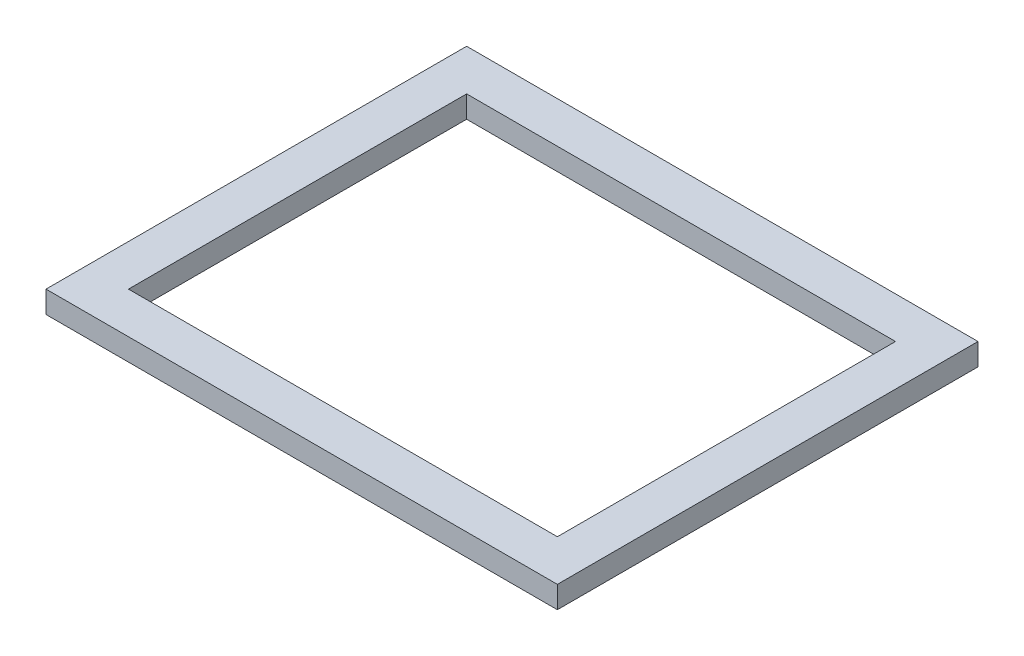
ISO-10303-21;
HEADER;
FILE_DESCRIPTION(('STEP AP214'),'2;1');
FILE_NAME('part.step','',(''),(''),'','','');
FILE_SCHEMA(('AUTOMOTIVE_DESIGN { 1 0 10303 214 1 1 1 1 }'));
ENDSEC;
DATA;
#1=APPLICATION_CONTEXT('core data for automotive mechanical design processes');
#2=APPLICATION_PROTOCOL_DEFINITION('international standard','automotive_design',2000,#1);
#3=PRODUCT_CONTEXT('',#1,'mechanical');
#4=PRODUCT('Part','Part','',(#3));
#5=PRODUCT_RELATED_PRODUCT_CATEGORY('part','',(#4));
#6=PRODUCT_DEFINITION_FORMATION('','',#4);
#7=PRODUCT_DEFINITION_CONTEXT('part definition',#1,'design');
#8=PRODUCT_DEFINITION('design','',#6,#7);
#9=PRODUCT_DEFINITION_SHAPE('','',#8);
#10=(LENGTH_UNIT() NAMED_UNIT(*) SI_UNIT(.MILLI.,.METRE.));
#11=(NAMED_UNIT(*) PLANE_ANGLE_UNIT() SI_UNIT($,.RADIAN.));
#12=(NAMED_UNIT(*) SI_UNIT($,.STERADIAN.) SOLID_ANGLE_UNIT());
#13=UNCERTAINTY_MEASURE_WITH_UNIT(LENGTH_MEASURE(1.E-05),#10,'distance_accuracy_value','');
#14=(GEOMETRIC_REPRESENTATION_CONTEXT(3) GLOBAL_UNCERTAINTY_ASSIGNED_CONTEXT((#13)) GLOBAL_UNIT_ASSIGNED_CONTEXT((#10,
#11,#12)) REPRESENTATION_CONTEXT('',''));
#15=CARTESIAN_POINT('',(0.,0.,0.));
#16=DIRECTION('',(0.,0.,1.));
#17=DIRECTION('',(1.,0.,0.));
#18=AXIS2_PLACEMENT_3D('',#15,#16,#17);
#19=CARTESIAN_POINT('',(0.,0.8,0.));
#20=DIRECTION('',(0.,1.,0.));
#21=DIRECTION('',(0.,0.,1.));
#22=AXIS2_PLACEMENT_3D('',#19,#20,#21);
#23=PLANE('',#22);
#24=DIRECTION('',(0.,0.,1.));
#25=VECTOR('',#24,1.);
#26=CARTESIAN_POINT('',(-9.3,0.8,-7.65));
#27=LINE('',#26,#25);
#28=CARTESIAN_POINT('',(-9.3,0.8,-7.65));
#29=VERTEX_POINT('',#28);
#30=CARTESIAN_POINT('',(-9.3,0.8,7.65));
#31=VERTEX_POINT('',#30);
#32=EDGE_CURVE('E182',#29,#31,#27,.T.);
#33=ORIENTED_EDGE('',*,*,#32,.T.);
#34=DIRECTION('',(1.,0.,0.));
#35=VECTOR('',#34,1.);
#36=CARTESIAN_POINT('',(-9.3,0.8,7.65));
#37=LINE('',#36,#35);
#38=CARTESIAN_POINT('',(9.3,0.8,7.65));
#39=VERTEX_POINT('',#38);
#40=EDGE_CURVE('E186',#31,#39,#37,.T.);
#41=ORIENTED_EDGE('',*,*,#40,.T.);
#42=DIRECTION('',(0.,0.,1.));
#43=VECTOR('',#42,1.);
#44=CARTESIAN_POINT('',(9.3,0.8,-7.65));
#45=LINE('',#44,#43);
#46=CARTESIAN_POINT('',(9.3,0.8,-7.65));
#47=VERTEX_POINT('',#46);
#48=EDGE_CURVE('E190',#47,#39,#45,.T.);
#49=ORIENTED_EDGE('',*,*,#48,.F.);
#50=DIRECTION('',(1.,0.,0.));
#51=VECTOR('',#50,1.);
#52=CARTESIAN_POINT('',(-9.3,0.8,-7.65));
#53=LINE('',#52,#51);
#54=EDGE_CURVE('E194',#29,#47,#53,.T.);
#55=ORIENTED_EDGE('',*,*,#54,.F.);
#56=EDGE_LOOP('',(#33,#41,#49,#55));
#57=FACE_BOUND('',#56,.T.);
#58=DIRECTION('',(1.,0.,0.));
#59=VECTOR('',#58,1.);
#60=CARTESIAN_POINT('',(-9.3,0.8,6.15));
#61=LINE('',#60,#59);
#62=CARTESIAN_POINT('',(-7.8,0.8,6.15));
#63=VERTEX_POINT('',#62);
#64=CARTESIAN_POINT('',(7.8,0.8,6.15));
#65=VERTEX_POINT('',#64);
#66=EDGE_CURVE('E145',#63,#65,#61,.T.);
#67=ORIENTED_EDGE('',*,*,#66,.F.);
#68=DIRECTION('',(0.,0.,1.));
#69=VECTOR('',#68,1.);
#70=CARTESIAN_POINT('',(-7.8,0.8,-7.65));
#71=LINE('',#70,#69);
#72=CARTESIAN_POINT('',(-7.8,0.8,-6.15));
#73=VERTEX_POINT('',#72);
#74=EDGE_CURVE('E135',#73,#63,#71,.T.);
#75=ORIENTED_EDGE('',*,*,#74,.F.);
#76=DIRECTION('',(1.,0.,0.));
#77=VECTOR('',#76,1.);
#78=CARTESIAN_POINT('',(-9.3,0.8,-6.15));
#79=LINE('',#78,#77);
#80=CARTESIAN_POINT('',(7.8,0.8,-6.15));
#81=VERTEX_POINT('',#80);
#82=EDGE_CURVE('E159',#73,#81,#79,.T.);
#83=ORIENTED_EDGE('',*,*,#82,.T.);
#84=DIRECTION('',(0.,0.,1.));
#85=VECTOR('',#84,1.);
#86=CARTESIAN_POINT('',(7.8,0.8,-7.65));
#87=LINE('',#86,#85);
#88=EDGE_CURVE('E85',#81,#65,#87,.T.);
#89=ORIENTED_EDGE('',*,*,#88,.T.);
#90=EDGE_LOOP('',(#67,#75,#83,#89));
#91=FACE_BOUND('',#90,.T.);
#92=ADVANCED_FACE('F69',(#57,#91),#23,.T.);
#93=CARTESIAN_POINT('',(0.,0.,0.));
#94=DIRECTION('',(0.,1.,0.));
#95=DIRECTION('',(0.,0.,1.));
#96=AXIS2_PLACEMENT_3D('',#93,#94,#95);
#97=PLANE('',#96);
#98=DIRECTION('',(0.,0.,1.));
#99=VECTOR('',#98,1.);
#100=CARTESIAN_POINT('',(-9.3,0.,-7.65));
#101=LINE('',#100,#99);
#102=CARTESIAN_POINT('',(-9.3,0.,-7.65));
#103=VERTEX_POINT('',#102);
#104=CARTESIAN_POINT('',(-9.3,0.,7.65));
#105=VERTEX_POINT('',#104);
#106=EDGE_CURVE('E153',#103,#105,#101,.T.);
#107=ORIENTED_EDGE('',*,*,#106,.F.);
#108=DIRECTION('',(1.,0.,0.));
#109=VECTOR('',#108,1.);
#110=CARTESIAN_POINT('',(-9.3,0.,-7.65));
#111=LINE('',#110,#109);
#112=CARTESIAN_POINT('',(9.3,0.,-7.65));
#113=VERTEX_POINT('',#112);
#114=EDGE_CURVE('E187',#103,#113,#111,.T.);
#115=ORIENTED_EDGE('',*,*,#114,.T.);
#116=DIRECTION('',(0.,0.,1.));
#117=VECTOR('',#116,1.);
#118=CARTESIAN_POINT('',(9.3,0.,-7.65));
#119=LINE('',#118,#117);
#120=CARTESIAN_POINT('',(9.3,0.,7.65));
#121=VERTEX_POINT('',#120);
#122=EDGE_CURVE('E206',#113,#121,#119,.T.);
#123=ORIENTED_EDGE('',*,*,#122,.T.);
#124=DIRECTION('',(1.,0.,0.));
#125=VECTOR('',#124,1.);
#126=CARTESIAN_POINT('',(-9.3,0.,7.65));
#127=LINE('',#126,#125);
#128=EDGE_CURVE('E202',#105,#121,#127,.T.);
#129=ORIENTED_EDGE('',*,*,#128,.F.);
#130=EDGE_LOOP('',(#107,#115,#123,#129));
#131=FACE_BOUND('',#130,.T.);
#132=DIRECTION('',(0.,0.,1.));
#133=VECTOR('',#132,1.);
#134=CARTESIAN_POINT('',(-7.8,0.,-7.65));
#135=LINE('',#134,#133);
#136=CARTESIAN_POINT('',(-7.8,0.,-6.15));
#137=VERTEX_POINT('',#136);
#138=CARTESIAN_POINT('',(-7.8,0.,6.15));
#139=VERTEX_POINT('',#138);
#140=EDGE_CURVE('E93',#137,#139,#135,.T.);
#141=ORIENTED_EDGE('',*,*,#140,.T.);
#142=DIRECTION('',(1.,0.,0.));
#143=VECTOR('',#142,1.);
#144=CARTESIAN_POINT('',(-9.3,0.,6.15));
#145=LINE('',#144,#143);
#146=CARTESIAN_POINT('',(7.8,0.,6.15));
#147=VERTEX_POINT('',#146);
#148=EDGE_CURVE('E151',#139,#147,#145,.T.);
#149=ORIENTED_EDGE('',*,*,#148,.T.);
#150=DIRECTION('',(0.,0.,1.));
#151=VECTOR('',#150,1.);
#152=CARTESIAN_POINT('',(7.8,0.,-7.65));
#153=LINE('',#152,#151);
#154=CARTESIAN_POINT('',(7.8,0.,-6.15));
#155=VERTEX_POINT('',#154);
#156=EDGE_CURVE('E168',#155,#147,#153,.T.);
#157=ORIENTED_EDGE('',*,*,#156,.F.);
#158=DIRECTION('',(1.,0.,0.));
#159=VECTOR('',#158,1.);
#160=CARTESIAN_POINT('',(-9.3,0.,-6.15));
#161=LINE('',#160,#159);
#162=EDGE_CURVE('E146',#137,#155,#161,.T.);
#163=ORIENTED_EDGE('',*,*,#162,.F.);
#164=EDGE_LOOP('',(#141,#149,#157,#163));
#165=FACE_BOUND('',#164,.T.);
#166=ADVANCED_FACE('F228',(#131,#165),#97,.F.);
#167=CARTESIAN_POINT('',(-9.3,0.8,-7.65));
#168=DIRECTION('',(1.,0.,0.));
#169=DIRECTION('',(0.,0.,-1.));
#170=AXIS2_PLACEMENT_3D('',#167,#168,#169);
#171=PLANE('',#170);
#172=ORIENTED_EDGE('',*,*,#106,.T.);
#173=DIRECTION('',(0.,-1.,0.));
#174=VECTOR('',#173,1.);
#175=CARTESIAN_POINT('',(-9.3,0.8,7.65));
#176=LINE('',#175,#174);
#177=EDGE_CURVE('E12',#31,#105,#176,.T.);
#178=ORIENTED_EDGE('',*,*,#177,.F.);
#179=ORIENTED_EDGE('',*,*,#32,.F.);
#180=DIRECTION('',(0.,-1.,0.));
#181=VECTOR('',#180,1.);
#182=CARTESIAN_POINT('',(-9.3,0.8,-7.65));
#183=LINE('',#182,#181);
#184=EDGE_CURVE('E198',#29,#103,#183,.T.);
#185=ORIENTED_EDGE('',*,*,#184,.T.);
#186=EDGE_LOOP('',(#172,#178,#179,#185));
#187=FACE_BOUND('',#186,.T.);
#188=ADVANCED_FACE('F71',(#187),#171,.F.);
#189=CARTESIAN_POINT('',(-9.3,0.8,7.65));
#190=DIRECTION('',(0.,0.,-1.));
#191=DIRECTION('',(-1.,0.,0.));
#192=AXIS2_PLACEMENT_3D('',#189,#190,#191);
#193=PLANE('',#192);
#194=ORIENTED_EDGE('',*,*,#128,.T.);
#195=DIRECTION('',(0.,-1.,0.));
#196=VECTOR('',#195,1.);
#197=CARTESIAN_POINT('',(9.3,0.8,7.65));
#198=LINE('',#197,#196);
#199=EDGE_CURVE('E78',#39,#121,#198,.T.);
#200=ORIENTED_EDGE('',*,*,#199,.F.);
#201=ORIENTED_EDGE('',*,*,#40,.F.);
#202=ORIENTED_EDGE('',*,*,#177,.T.);
#203=EDGE_LOOP('',(#194,#200,#201,#202));
#204=FACE_BOUND('',#203,.T.);
#205=ADVANCED_FACE('F224',(#204),#193,.F.);
#206=CARTESIAN_POINT('',(9.3,0.8,-7.65));
#207=DIRECTION('',(1.,0.,0.));
#208=DIRECTION('',(0.,0.,-1.));
#209=AXIS2_PLACEMENT_3D('',#206,#207,#208);
#210=PLANE('',#209);
#211=ORIENTED_EDGE('',*,*,#122,.F.);
#212=DIRECTION('',(0.,-1.,0.));
#213=VECTOR('',#212,1.);
#214=CARTESIAN_POINT('',(9.3,0.8,-7.65));
#215=LINE('',#214,#213);
#216=EDGE_CURVE('E215',#47,#113,#215,.T.);
#217=ORIENTED_EDGE('',*,*,#216,.F.);
#218=ORIENTED_EDGE('',*,*,#48,.T.);
#219=ORIENTED_EDGE('',*,*,#199,.T.);
#220=EDGE_LOOP('',(#211,#217,#218,#219));
#221=FACE_BOUND('',#220,.T.);
#222=ADVANCED_FACE('F221',(#221),#210,.T.);
#223=CARTESIAN_POINT('',(-9.3,0.8,-7.65));
#224=DIRECTION('',(0.,0.,-1.));
#225=DIRECTION('',(-1.,0.,0.));
#226=AXIS2_PLACEMENT_3D('',#223,#224,#225);
#227=PLANE('',#226);
#228=ORIENTED_EDGE('',*,*,#114,.F.);
#229=ORIENTED_EDGE('',*,*,#184,.F.);
#230=ORIENTED_EDGE('',*,*,#54,.T.);
#231=ORIENTED_EDGE('',*,*,#216,.T.);
#232=EDGE_LOOP('',(#228,#229,#230,#231));
#233=FACE_BOUND('',#232,.T.);
#234=ADVANCED_FACE('F232',(#233),#227,.T.);
#235=CARTESIAN_POINT('',(-7.8,0.8,-7.65));
#236=DIRECTION('',(1.,0.,0.));
#237=DIRECTION('',(0.,0.,-1.));
#238=AXIS2_PLACEMENT_3D('',#235,#236,#237);
#239=PLANE('',#238);
#240=ORIENTED_EDGE('',*,*,#140,.F.);
#241=DIRECTION('',(0.,-1.,0.));
#242=VECTOR('',#241,1.);
#243=CARTESIAN_POINT('',(-7.8,0.8,-6.15));
#244=LINE('',#243,#242);
#245=EDGE_CURVE('E139',#73,#137,#244,.T.);
#246=ORIENTED_EDGE('',*,*,#245,.F.);
#247=ORIENTED_EDGE('',*,*,#74,.T.);
#248=DIRECTION('',(0.,-1.,0.));
#249=VECTOR('',#248,1.);
#250=CARTESIAN_POINT('',(-7.8,0.8,6.15));
#251=LINE('',#250,#249);
#252=EDGE_CURVE('E138',#63,#139,#251,.T.);
#253=ORIENTED_EDGE('',*,*,#252,.T.);
#254=EDGE_LOOP('',(#240,#246,#247,#253));
#255=FACE_BOUND('',#254,.T.);
#256=ADVANCED_FACE('F137',(#255),#239,.T.);
#257=CARTESIAN_POINT('',(-9.3,0.8,6.15));
#258=DIRECTION('',(0.,0.,-1.));
#259=DIRECTION('',(-1.,0.,0.));
#260=AXIS2_PLACEMENT_3D('',#257,#258,#259);
#261=PLANE('',#260);
#262=ORIENTED_EDGE('',*,*,#148,.F.);
#263=ORIENTED_EDGE('',*,*,#252,.F.);
#264=ORIENTED_EDGE('',*,*,#66,.T.);
#265=DIRECTION('',(0.,-1.,0.));
#266=VECTOR('',#265,1.);
#267=CARTESIAN_POINT('',(7.8,0.8,6.15));
#268=LINE('',#267,#266);
#269=EDGE_CURVE('E154',#65,#147,#268,.T.);
#270=ORIENTED_EDGE('',*,*,#269,.T.);
#271=EDGE_LOOP('',(#262,#263,#264,#270));
#272=FACE_BOUND('',#271,.T.);
#273=ADVANCED_FACE('F149',(#272),#261,.T.);
#274=CARTESIAN_POINT('',(7.8,0.8,-7.65));
#275=DIRECTION('',(1.,0.,0.));
#276=DIRECTION('',(0.,0.,-1.));
#277=AXIS2_PLACEMENT_3D('',#274,#275,#276);
#278=PLANE('',#277);
#279=ORIENTED_EDGE('',*,*,#156,.T.);
#280=ORIENTED_EDGE('',*,*,#269,.F.);
#281=ORIENTED_EDGE('',*,*,#88,.F.);
#282=DIRECTION('',(0.,-1.,0.));
#283=VECTOR('',#282,1.);
#284=CARTESIAN_POINT('',(7.8,0.8,-6.15));
#285=LINE('',#284,#283);
#286=EDGE_CURVE('E177',#81,#155,#285,.T.);
#287=ORIENTED_EDGE('',*,*,#286,.T.);
#288=EDGE_LOOP('',(#279,#280,#281,#287));
#289=FACE_BOUND('',#288,.T.);
#290=ADVANCED_FACE('F275',(#289),#278,.F.);
#291=CARTESIAN_POINT('',(-9.3,0.8,-6.15));
#292=DIRECTION('',(0.,0.,-1.));
#293=DIRECTION('',(-1.,0.,0.));
#294=AXIS2_PLACEMENT_3D('',#291,#292,#293);
#295=PLANE('',#294);
#296=ORIENTED_EDGE('',*,*,#162,.T.);
#297=ORIENTED_EDGE('',*,*,#286,.F.);
#298=ORIENTED_EDGE('',*,*,#82,.F.);
#299=ORIENTED_EDGE('',*,*,#245,.T.);
#300=EDGE_LOOP('',(#296,#297,#298,#299));
#301=FACE_BOUND('',#300,.T.);
#302=ADVANCED_FACE('F282',(#301),#295,.F.);
#303=CLOSED_SHELL('',(#92,#166,#188,#205,#222,#234,#256,#273,#290,#302));
#304=MANIFOLD_SOLID_BREP('B2',#303);
#305=ADVANCED_BREP_SHAPE_REPRESENTATION('',(#18,#304),#14);
#306=SHAPE_DEFINITION_REPRESENTATION(#9,#305);
ENDSEC;
END-ISO-10303-21;
